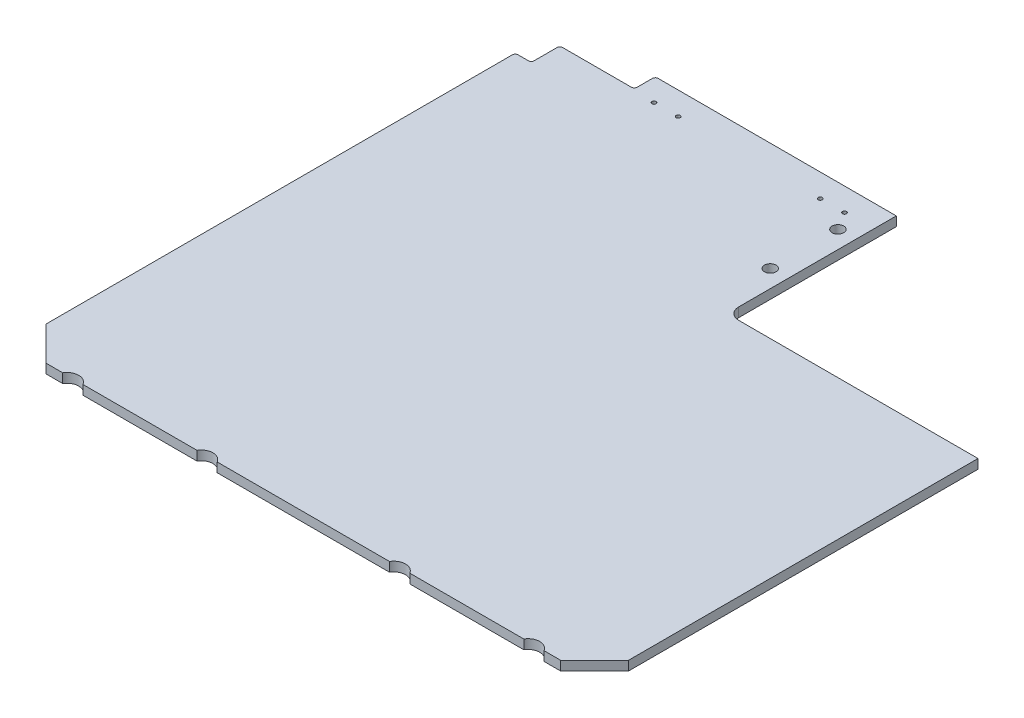
ISO-10303-21;
HEADER;
FILE_DESCRIPTION(('STEP AP214'),'2;1');
FILE_NAME('part.step','',(''),(''),'','','');
FILE_SCHEMA(('AUTOMOTIVE_DESIGN { 1 0 10303 214 1 1 1 1 }'));
ENDSEC;
DATA;
#1=APPLICATION_CONTEXT('core data for automotive mechanical design processes');
#2=APPLICATION_PROTOCOL_DEFINITION('international standard','automotive_design',2000,#1);
#3=PRODUCT_CONTEXT('',#1,'mechanical');
#4=PRODUCT('Part','Part','',(#3));
#5=PRODUCT_RELATED_PRODUCT_CATEGORY('part','',(#4));
#6=PRODUCT_DEFINITION_FORMATION('','',#4);
#7=PRODUCT_DEFINITION_CONTEXT('part definition',#1,'design');
#8=PRODUCT_DEFINITION('design','',#6,#7);
#9=PRODUCT_DEFINITION_SHAPE('','',#8);
#10=(LENGTH_UNIT() NAMED_UNIT(*) SI_UNIT(.MILLI.,.METRE.));
#11=(NAMED_UNIT(*) PLANE_ANGLE_UNIT() SI_UNIT($,.RADIAN.));
#12=(NAMED_UNIT(*) SI_UNIT($,.STERADIAN.) SOLID_ANGLE_UNIT());
#13=UNCERTAINTY_MEASURE_WITH_UNIT(LENGTH_MEASURE(1.E-05),#10,'distance_accuracy_value','');
#14=(GEOMETRIC_REPRESENTATION_CONTEXT(3) GLOBAL_UNCERTAINTY_ASSIGNED_CONTEXT((#13)) GLOBAL_UNIT_ASSIGNED_CONTEXT((#10,
#11,#12)) REPRESENTATION_CONTEXT('',''));
#15=CARTESIAN_POINT('',(0.,0.,0.));
#16=DIRECTION('',(0.,0.,1.));
#17=DIRECTION('',(1.,0.,0.));
#18=AXIS2_PLACEMENT_3D('',#15,#16,#17);
#19=CARTESIAN_POINT('',(-44.4499999999997,0.799999999999967,44.4500000000004));
#20=DIRECTION('',(0.707106781186542,0.,-0.707106781186553));
#21=DIRECTION('',(-0.707106781186553,0.,-0.707106781186542));
#22=AXIS2_PLACEMENT_3D('',#19,#20,#21);
#23=PLANE('',#22);
#24=DIRECTION('',(0.,1.,0.));
#25=VECTOR('',#24,1.);
#26=CARTESIAN_POINT('',(-44.1000000000001,-0.800000000000023,44.8));
#27=LINE('',#26,#25);
#28=CARTESIAN_POINT('',(-44.1000000000001,-0.800000000000023,44.8));
#29=VERTEX_POINT('',#28);
#30=CARTESIAN_POINT('',(-44.1000000000001,0.799999999999967,44.8));
#31=VERTEX_POINT('',#30);
#32=EDGE_CURVE('E493',#29,#31,#27,.T.);
#33=ORIENTED_EDGE('',*,*,#32,.T.);
#34=DIRECTION('',(0.707106781186553,0.,0.707106781186542));
#35=VECTOR('',#34,1.);
#36=CARTESIAN_POINT('',(-44.4499999999997,0.799999999999967,44.4500000000004));
#37=LINE('',#36,#35);
#38=CARTESIAN_POINT('',(-49.9000000000001,0.799999999999967,39.));
#39=VERTEX_POINT('',#38);
#40=EDGE_CURVE('E269',#39,#31,#37,.T.);
#41=ORIENTED_EDGE('',*,*,#40,.F.);
#42=DIRECTION('',(0.,1.,0.));
#43=VECTOR('',#42,1.);
#44=CARTESIAN_POINT('',(-49.9000000000001,-0.800000000000023,39.));
#45=LINE('',#44,#43);
#46=CARTESIAN_POINT('',(-49.9000000000001,-0.800000000000023,39.));
#47=VERTEX_POINT('',#46);
#48=EDGE_CURVE('E263',#47,#39,#45,.T.);
#49=ORIENTED_EDGE('',*,*,#48,.F.);
#50=DIRECTION('',(0.707106781186553,0.,0.707106781186542));
#51=VECTOR('',#50,1.);
#52=CARTESIAN_POINT('',(-44.4499999999997,-0.800000000000023,44.4500000000004));
#53=LINE('',#52,#51);
#54=EDGE_CURVE('E266',#47,#29,#53,.T.);
#55=ORIENTED_EDGE('',*,*,#54,.T.);
#56=EDGE_LOOP('',(#33,#41,#49,#55));
#57=FACE_BOUND('',#56,.T.);
#58=ADVANCED_FACE('F39',(#57),#23,.F.);
#59=CARTESIAN_POINT('',(44.4499999999995,0.800000000000023,44.4499999999995));
#60=DIRECTION('',(-0.707106781186548,0.,-0.707106781186548));
#61=DIRECTION('',(-0.707106781186548,0.,0.707106781186548));
#62=AXIS2_PLACEMENT_3D('',#59,#60,#61);
#63=PLANE('',#62);
#64=DIRECTION('',(0.,1.,0.));
#65=VECTOR('',#64,1.);
#66=CARTESIAN_POINT('',(44.0999999999991,-0.799999999999967,44.8));
#67=LINE('',#66,#65);
#68=CARTESIAN_POINT('',(44.0999999999991,-0.799999999999967,44.8));
#69=VERTEX_POINT('',#68);
#70=CARTESIAN_POINT('',(44.0999999999991,0.800000000000023,44.8));
#71=VERTEX_POINT('',#70);
#72=EDGE_CURVE('E563',#69,#71,#67,.T.);
#73=ORIENTED_EDGE('',*,*,#72,.F.);
#74=DIRECTION('',(0.707106781186548,0.,-0.707106781186548));
#75=VECTOR('',#74,1.);
#76=CARTESIAN_POINT('',(44.4499999999995,-0.799999999999967,44.4499999999995));
#77=LINE('',#76,#75);
#78=CARTESIAN_POINT('',(49.9000000000001,-0.799999999999967,38.999999999999));
#79=VERTEX_POINT('',#78);
#80=EDGE_CURVE('E272',#69,#79,#77,.T.);
#81=ORIENTED_EDGE('',*,*,#80,.T.);
#82=DIRECTION('',(0.,1.,0.));
#83=VECTOR('',#82,1.);
#84=CARTESIAN_POINT('',(49.9000000000001,-0.799999999999967,38.999999999999));
#85=LINE('',#84,#83);
#86=CARTESIAN_POINT('',(49.9000000000001,0.800000000000023,38.999999999999));
#87=VERTEX_POINT('',#86);
#88=EDGE_CURVE('E264',#79,#87,#85,.T.);
#89=ORIENTED_EDGE('',*,*,#88,.T.);
#90=DIRECTION('',(0.707106781186548,0.,-0.707106781186548));
#91=VECTOR('',#90,1.);
#92=CARTESIAN_POINT('',(44.4499999999995,0.800000000000023,44.4499999999995));
#93=LINE('',#92,#91);
#94=EDGE_CURVE('E241',#71,#87,#93,.T.);
#95=ORIENTED_EDGE('',*,*,#94,.F.);
#96=EDGE_LOOP('',(#73,#81,#89,#95));
#97=FACE_BOUND('',#96,.T.);
#98=ADVANCED_FACE('F383',(#97),#63,.F.);
#99=CARTESIAN_POINT('',(0.,0.799999999999995,0.));
#100=DIRECTION('',(0.,1.,0.));
#101=DIRECTION('',(0.,0.,1.));
#102=AXIS2_PLACEMENT_3D('',#99,#100,#101);
#103=PLANE('',#102);
#104=DIRECTION('',(0.,0.,-1.));
#105=VECTOR('',#104,1.);
#106=CARTESIAN_POINT('',(6.90000000000007,0.799999999999995,-22.9));
#107=LINE('',#106,#105);
#108=CARTESIAN_POINT('',(6.90000000000007,0.799999999999995,-22.9));
#109=VERTEX_POINT('',#108);
#110=CARTESIAN_POINT('',(6.90000000000007,0.799999999999995,-49.9));
#111=VERTEX_POINT('',#110);
#112=EDGE_CURVE('E234',#109,#111,#107,.T.);
#113=ORIENTED_EDGE('',*,*,#112,.T.);
#114=DIRECTION('',(-1.,0.,0.));
#115=VECTOR('',#114,1.);
#116=CARTESIAN_POINT('',(0.,0.799999999999995,-49.9));
#117=LINE('',#116,#115);
#118=CARTESIAN_POINT('',(-33.9000000000002,0.799999999999981,-49.9));
#119=VERTEX_POINT('',#118);
#120=EDGE_CURVE('E243',#111,#119,#117,.T.);
#121=ORIENTED_EDGE('',*,*,#120,.T.);
#122=CARTESIAN_POINT('',(-33.9000000000002,0.799999999999981,-49.4));
#123=DIRECTION('',(0.,1.,0.));
#124=DIRECTION('',(0.,0.,1.));
#125=AXIS2_PLACEMENT_3D('',#122,#123,#124);
#126=CIRCLE('',#125,0.5);
#127=CARTESIAN_POINT('',(-34.4000000000002,0.799999999999981,-49.4));
#128=VERTEX_POINT('',#127);
#129=EDGE_CURVE('E307',#119,#128,#126,.T.);
#130=ORIENTED_EDGE('',*,*,#129,.T.);
#131=DIRECTION('',(0.,0.,1.));
#132=VECTOR('',#131,1.);
#133=CARTESIAN_POINT('',(-34.4000000000002,0.799999999999981,0.));
#134=LINE('',#133,#132);
#135=CARTESIAN_POINT('',(-34.4000000000002,0.799999999999981,-46.8));
#136=VERTEX_POINT('',#135);
#137=EDGE_CURVE('E247',#128,#136,#134,.T.);
#138=ORIENTED_EDGE('',*,*,#137,.T.);
#139=CARTESIAN_POINT('',(-34.9000000000002,0.799999999999981,-46.8));
#140=DIRECTION('',(0.,1.,0.));
#141=DIRECTION('',(0.,0.,1.));
#142=AXIS2_PLACEMENT_3D('',#139,#140,#141);
#143=CIRCLE('',#142,0.5);
#144=CARTESIAN_POINT('',(-34.9000000000002,0.799999999999981,-46.3));
#145=VERTEX_POINT('',#144);
#146=EDGE_CURVE('E300',#136,#145,#143,.F.);
#147=ORIENTED_EDGE('',*,*,#146,.T.);
#148=DIRECTION('',(-1.,0.,0.));
#149=VECTOR('',#148,1.);
#150=CARTESIAN_POINT('',(0.,0.799999999999995,-46.3));
#151=LINE('',#150,#149);
#152=CARTESIAN_POINT('',(-46.6500000000002,0.799999999999967,-46.3));
#153=VERTEX_POINT('',#152);
#154=EDGE_CURVE('E331',#145,#153,#151,.T.);
#155=ORIENTED_EDGE('',*,*,#154,.T.);
#156=CARTESIAN_POINT('',(-46.6500000000002,0.799999999999967,-45.8));
#157=DIRECTION('',(0.,1.,0.));
#158=DIRECTION('',(0.,0.,1.));
#159=AXIS2_PLACEMENT_3D('',#156,#157,#158);
#160=CIRCLE('',#159,0.5);
#161=CARTESIAN_POINT('',(-47.1500000000002,0.799999999999967,-45.8));
#162=VERTEX_POINT('',#161);
#163=EDGE_CURVE('E289',#153,#162,#160,.T.);
#164=ORIENTED_EDGE('',*,*,#163,.T.);
#165=DIRECTION('',(0.,0.,1.));
#166=VECTOR('',#165,1.);
#167=CARTESIAN_POINT('',(-47.1500000000002,0.799999999999967,0.));
#168=LINE('',#167,#166);
#169=CARTESIAN_POINT('',(-47.1500000000002,0.799999999999967,-41.9));
#170=VERTEX_POINT('',#169);
#171=EDGE_CURVE('E328',#162,#170,#168,.T.);
#172=ORIENTED_EDGE('',*,*,#171,.T.);
#173=CARTESIAN_POINT('',(-47.6500000000002,0.799999999999967,-41.9));
#174=DIRECTION('',(0.,1.,0.));
#175=DIRECTION('',(0.,0.,1.));
#176=AXIS2_PLACEMENT_3D('',#173,#174,#175);
#177=CIRCLE('',#176,0.5);
#178=CARTESIAN_POINT('',(-47.6500000000002,0.799999999999967,-41.4));
#179=VERTEX_POINT('',#178);
#180=EDGE_CURVE('E296',#170,#179,#177,.F.);
#181=ORIENTED_EDGE('',*,*,#180,.T.);
#182=DIRECTION('',(-1.,0.,0.));
#183=VECTOR('',#182,1.);
#184=CARTESIAN_POINT('',(1.0449742081743E-12,0.799999999999995,-41.3999999999988));
#185=LINE('',#184,#183);
#186=CARTESIAN_POINT('',(-49.4,0.799999999999967,-41.4000000000001));
#187=VERTEX_POINT('',#186);
#188=EDGE_CURVE('E323',#179,#187,#185,.T.);
#189=ORIENTED_EDGE('',*,*,#188,.T.);
#190=CARTESIAN_POINT('',(-49.4000000000001,0.799999999999967,-40.9000000000001));
#191=DIRECTION('',(0.,1.,0.));
#192=DIRECTION('',(0.,0.,1.));
#193=AXIS2_PLACEMENT_3D('',#190,#191,#192);
#194=CIRCLE('',#193,0.5);
#195=CARTESIAN_POINT('',(-49.9000000000001,0.799999999999967,-40.9000000000001));
#196=VERTEX_POINT('',#195);
#197=EDGE_CURVE('E305',#187,#196,#194,.T.);
#198=ORIENTED_EDGE('',*,*,#197,.T.);
#199=DIRECTION('',(0.,0.,1.));
#200=VECTOR('',#199,1.);
#201=CARTESIAN_POINT('',(-49.9000000000001,0.799999999999967,0.));
#202=LINE('',#201,#200);
#203=EDGE_CURVE('E329',#196,#39,#202,.T.);
#204=ORIENTED_EDGE('',*,*,#203,.T.);
#205=ORIENTED_EDGE('',*,*,#40,.T.);
#206=DIRECTION('',(1.,0.,0.));
#207=VECTOR('',#206,1.);
#208=CARTESIAN_POINT('',(0.,0.799999999999995,44.8));
#209=LINE('',#208,#207);
#210=CARTESIAN_POINT('',(-41.2320508075689,0.799999999999967,44.8));
#211=VERTEX_POINT('',#210);
#212=EDGE_CURVE('E496',#31,#211,#209,.T.);
#213=ORIENTED_EDGE('',*,*,#212,.T.);
#214=CARTESIAN_POINT('',(-39.5,0.799999999999981,45.8));
#215=DIRECTION('',(0.,1.,0.));
#216=DIRECTION('',(0.,0.,1.));
#217=AXIS2_PLACEMENT_3D('',#214,#215,#216);
#218=CIRCLE('',#217,2.);
#219=CARTESIAN_POINT('',(-37.7679491924311,0.799999999999981,44.8));
#220=VERTEX_POINT('',#219);
#221=EDGE_CURVE('E499',#220,#211,#218,.T.);
#222=ORIENTED_EDGE('',*,*,#221,.F.);
#223=DIRECTION('',(1.,0.,0.));
#224=VECTOR('',#223,1.);
#225=CARTESIAN_POINT('',(0.,0.799999999999995,44.8));
#226=LINE('',#225,#224);
#227=CARTESIAN_POINT('',(-18.2320508075689,0.799999999999995,44.8));
#228=VERTEX_POINT('',#227);
#229=EDGE_CURVE('E525',#220,#228,#226,.T.);
#230=ORIENTED_EDGE('',*,*,#229,.T.);
#231=CARTESIAN_POINT('',(-16.5,0.799999999999995,45.8));
#232=DIRECTION('',(0.,1.,0.));
#233=DIRECTION('',(0.,0.,1.));
#234=AXIS2_PLACEMENT_3D('',#231,#232,#233);
#235=CIRCLE('',#234,2.);
#236=CARTESIAN_POINT('',(-14.7679491924311,0.799999999999981,44.8));
#237=VERTEX_POINT('',#236);
#238=EDGE_CURVE('E522',#237,#228,#235,.T.);
#239=ORIENTED_EDGE('',*,*,#238,.F.);
#240=DIRECTION('',(1.,0.,0.));
#241=VECTOR('',#240,1.);
#242=CARTESIAN_POINT('',(0.,0.799999999999995,44.8));
#243=LINE('',#242,#241);
#244=CARTESIAN_POINT('',(14.7679491924311,0.800000000000009,44.8));
#245=VERTEX_POINT('',#244);
#246=EDGE_CURVE('E519',#237,#245,#243,.T.);
#247=ORIENTED_EDGE('',*,*,#246,.T.);
#248=CARTESIAN_POINT('',(16.5,0.800000000000009,45.8));
#249=DIRECTION('',(0.,1.,0.));
#250=DIRECTION('',(0.,0.,1.));
#251=AXIS2_PLACEMENT_3D('',#248,#249,#250);
#252=CIRCLE('',#251,2.);
#253=CARTESIAN_POINT('',(18.2320508075689,0.800000000000009,44.8));
#254=VERTEX_POINT('',#253);
#255=EDGE_CURVE('E516',#254,#245,#252,.T.);
#256=ORIENTED_EDGE('',*,*,#255,.F.);
#257=DIRECTION('',(1.,0.,0.));
#258=VECTOR('',#257,1.);
#259=CARTESIAN_POINT('',(0.,0.799999999999995,44.8));
#260=LINE('',#259,#258);
#261=CARTESIAN_POINT('',(37.7679491924311,0.800000000000009,44.8));
#262=VERTEX_POINT('',#261);
#263=EDGE_CURVE('E513',#254,#262,#260,.T.);
#264=ORIENTED_EDGE('',*,*,#263,.T.);
#265=CARTESIAN_POINT('',(39.5,0.800000000000009,45.8));
#266=DIRECTION('',(0.,1.,0.));
#267=DIRECTION('',(0.,0.,1.));
#268=AXIS2_PLACEMENT_3D('',#265,#266,#267);
#269=CIRCLE('',#268,2.);
#270=CARTESIAN_POINT('',(41.2320508075689,0.800000000000009,44.8));
#271=VERTEX_POINT('',#270);
#272=EDGE_CURVE('E503',#271,#262,#269,.T.);
#273=ORIENTED_EDGE('',*,*,#272,.F.);
#274=DIRECTION('',(1.,0.,0.));
#275=VECTOR('',#274,1.);
#276=CARTESIAN_POINT('',(0.,0.799999999999995,44.8));
#277=LINE('',#276,#275);
#278=EDGE_CURVE('E500',#271,#71,#277,.T.);
#279=ORIENTED_EDGE('',*,*,#278,.T.);
#280=ORIENTED_EDGE('',*,*,#94,.T.);
#281=DIRECTION('',(0.,0.,-1.));
#282=VECTOR('',#281,1.);
#283=CARTESIAN_POINT('',(49.9000000000001,0.800000000000023,0.));
#284=LINE('',#283,#282);
#285=CARTESIAN_POINT('',(49.9000000000001,0.800000000000023,-20.9));
#286=VERTEX_POINT('',#285);
#287=EDGE_CURVE('E230',#87,#286,#284,.T.);
#288=ORIENTED_EDGE('',*,*,#287,.T.);
#289=DIRECTION('',(-1.,0.,0.));
#290=VECTOR('',#289,1.);
#291=CARTESIAN_POINT('',(49.9000000000001,0.800000000000023,-20.9));
#292=LINE('',#291,#290);
#293=CARTESIAN_POINT('',(8.90000000000008,0.800000000000009,-20.9));
#294=VERTEX_POINT('',#293);
#295=EDGE_CURVE('E212',#286,#294,#292,.T.);
#296=ORIENTED_EDGE('',*,*,#295,.T.);
#297=CARTESIAN_POINT('',(8.90000000000007,0.800000000000009,-22.9));
#298=DIRECTION('',(0.,-1.,0.));
#299=DIRECTION('',(0.,0.,-1.));
#300=AXIS2_PLACEMENT_3D('',#297,#298,#299);
#301=CIRCLE('',#300,2.);
#302=EDGE_CURVE('E223',#294,#109,#301,.T.);
#303=ORIENTED_EDGE('',*,*,#302,.T.);
#304=EDGE_LOOP('',(#113,#121,#130,#138,#147,#155,#164,#172,#181,#189,#198,#204,#205,#213,#222,
#230,#239,#247,#256,#264,#273,#279,#280,#288,#296,#303));
#305=FACE_BOUND('',#304,.T.);
#306=CARTESIAN_POINT('',(1.97500000000007,0.799999999999995,-45.95));
#307=DIRECTION('',(0.,-1.,0.));
#308=DIRECTION('',(0.,0.,-1.));
#309=AXIS2_PLACEMENT_3D('',#306,#307,#308);
#310=CIRCLE('',#309,0.349999999999992);
#311=CARTESIAN_POINT('',(1.97500000000007,0.799999999999995,-46.3));
#312=VERTEX_POINT('',#311);
#313=EDGE_CURVE('E574',#312,#312,#310,.T.);
#314=ORIENTED_EDGE('',*,*,#313,.T.);
#315=EDGE_LOOP('',(#314));
#316=FACE_BOUND('',#315,.T.);
#317=CARTESIAN_POINT('',(-2.17499999999993,0.799999999999995,-45.95));
#318=DIRECTION('',(0.,-1.,0.));
#319=DIRECTION('',(0.,0.,-1.));
#320=AXIS2_PLACEMENT_3D('',#317,#318,#319);
#321=CIRCLE('',#320,0.349999999999991);
#322=CARTESIAN_POINT('',(-2.17499999999993,0.799999999999995,-46.3));
#323=VERTEX_POINT('',#322);
#324=EDGE_CURVE('E588',#323,#323,#321,.T.);
#325=ORIENTED_EDGE('',*,*,#324,.T.);
#326=EDGE_LOOP('',(#325));
#327=FACE_BOUND('',#326,.T.);
#328=CARTESIAN_POINT('',(-26.5249999999999,0.799999999999981,-45.95));
#329=DIRECTION('',(0.,-1.,0.));
#330=DIRECTION('',(0.,0.,-1.));
#331=AXIS2_PLACEMENT_3D('',#328,#329,#330);
#332=CIRCLE('',#331,0.350000000000008);
#333=CARTESIAN_POINT('',(-26.5249999999999,0.799999999999981,-46.3));
#334=VERTEX_POINT('',#333);
#335=EDGE_CURVE('E594',#334,#334,#332,.T.);
#336=ORIENTED_EDGE('',*,*,#335,.T.);
#337=EDGE_LOOP('',(#336));
#338=FACE_BOUND('',#337,.T.);
#339=CARTESIAN_POINT('',(-30.6749999999999,0.799999999999981,-45.95));
#340=DIRECTION('',(0.,-1.,0.));
#341=DIRECTION('',(0.,0.,-1.));
#342=AXIS2_PLACEMENT_3D('',#339,#340,#341);
#343=CIRCLE('',#342,0.350000000000008);
#344=CARTESIAN_POINT('',(-30.6749999999999,0.799999999999981,-46.3));
#345=VERTEX_POINT('',#344);
#346=EDGE_CURVE('E600',#345,#345,#343,.T.);
#347=ORIENTED_EDGE('',*,*,#346,.T.);
#348=EDGE_LOOP('',(#347));
#349=FACE_BOUND('',#348,.T.);
#350=CARTESIAN_POINT('',(3.90000000000007,0.799999999999995,-42.9));
#351=DIRECTION('',(0.,-1.,0.));
#352=DIRECTION('',(0.,0.,-1.));
#353=AXIS2_PLACEMENT_3D('',#350,#351,#352);
#354=CIRCLE('',#353,0.999999999999995);
#355=CARTESIAN_POINT('',(3.90000000000007,0.799999999999995,-43.9));
#356=VERTEX_POINT('',#355);
#357=EDGE_CURVE('E606',#356,#356,#354,.T.);
#358=ORIENTED_EDGE('',*,*,#357,.T.);
#359=EDGE_LOOP('',(#358));
#360=FACE_BOUND('',#359,.T.);
#361=CARTESIAN_POINT('',(3.90000000000007,0.799999999999995,-31.3));
#362=DIRECTION('',(0.,-1.,0.));
#363=DIRECTION('',(0.,0.,-1.));
#364=AXIS2_PLACEMENT_3D('',#361,#362,#363);
#365=CIRCLE('',#364,0.999999999999994);
#366=CARTESIAN_POINT('',(3.90000000000007,0.799999999999995,-32.3));
#367=VERTEX_POINT('',#366);
#368=EDGE_CURVE('E611',#367,#367,#365,.T.);
#369=ORIENTED_EDGE('',*,*,#368,.T.);
#370=EDGE_LOOP('',(#369));
#371=FACE_BOUND('',#370,.T.);
#372=ADVANCED_FACE('F237',(#305,#316,#327,#338,#349,#360,#371),#103,.T.);
#373=CARTESIAN_POINT('',(0.,-0.799999999999995,0.));
#374=DIRECTION('',(0.,1.,0.));
#375=DIRECTION('',(0.,0.,1.));
#376=AXIS2_PLACEMENT_3D('',#373,#374,#375);
#377=PLANE('',#376);
#378=CARTESIAN_POINT('',(1.97500000000007,-0.799999999999995,-45.95));
#379=DIRECTION('',(0.,-1.,0.));
#380=DIRECTION('',(0.,0.,-1.));
#381=AXIS2_PLACEMENT_3D('',#378,#379,#380);
#382=CIRCLE('',#381,0.349999999999992);
#383=CARTESIAN_POINT('',(1.97500000000007,-0.799999999999995,-46.3));
#384=VERTEX_POINT('',#383);
#385=EDGE_CURVE('E578',#384,#384,#382,.T.);
#386=ORIENTED_EDGE('',*,*,#385,.F.);
#387=EDGE_LOOP('',(#386));
#388=FACE_BOUND('',#387,.T.);
#389=CARTESIAN_POINT('',(-2.17499999999993,-0.799999999999995,-45.95));
#390=DIRECTION('',(0.,-1.,0.));
#391=DIRECTION('',(0.,0.,-1.));
#392=AXIS2_PLACEMENT_3D('',#389,#390,#391);
#393=CIRCLE('',#392,0.349999999999991);
#394=CARTESIAN_POINT('',(-2.17499999999993,-0.799999999999995,-46.3));
#395=VERTEX_POINT('',#394);
#396=EDGE_CURVE('E591',#395,#395,#393,.T.);
#397=ORIENTED_EDGE('',*,*,#396,.F.);
#398=EDGE_LOOP('',(#397));
#399=FACE_BOUND('',#398,.T.);
#400=CARTESIAN_POINT('',(-26.5249999999999,-0.800000000000009,-45.95));
#401=DIRECTION('',(0.,-1.,0.));
#402=DIRECTION('',(0.,0.,-1.));
#403=AXIS2_PLACEMENT_3D('',#400,#401,#402);
#404=CIRCLE('',#403,0.350000000000008);
#405=CARTESIAN_POINT('',(-26.5249999999999,-0.800000000000009,-46.3));
#406=VERTEX_POINT('',#405);
#407=EDGE_CURVE('E597',#406,#406,#404,.T.);
#408=ORIENTED_EDGE('',*,*,#407,.F.);
#409=EDGE_LOOP('',(#408));
#410=FACE_BOUND('',#409,.T.);
#411=CARTESIAN_POINT('',(-30.6749999999999,-0.800000000000009,-45.95));
#412=DIRECTION('',(0.,-1.,0.));
#413=DIRECTION('',(0.,0.,-1.));
#414=AXIS2_PLACEMENT_3D('',#411,#412,#413);
#415=CIRCLE('',#414,0.350000000000008);
#416=CARTESIAN_POINT('',(-30.6749999999999,-0.800000000000009,-46.3));
#417=VERTEX_POINT('',#416);
#418=EDGE_CURVE('E603',#417,#417,#415,.T.);
#419=ORIENTED_EDGE('',*,*,#418,.F.);
#420=EDGE_LOOP('',(#419));
#421=FACE_BOUND('',#420,.T.);
#422=CARTESIAN_POINT('',(3.90000000000007,-0.799999999999995,-42.9));
#423=DIRECTION('',(0.,-1.,0.));
#424=DIRECTION('',(0.,0.,-1.));
#425=AXIS2_PLACEMENT_3D('',#422,#423,#424);
#426=CIRCLE('',#425,0.999999999999995);
#427=CARTESIAN_POINT('',(3.90000000000007,-0.799999999999995,-43.9));
#428=VERTEX_POINT('',#427);
#429=EDGE_CURVE('E609',#428,#428,#426,.T.);
#430=ORIENTED_EDGE('',*,*,#429,.F.);
#431=EDGE_LOOP('',(#430));
#432=FACE_BOUND('',#431,.T.);
#433=CARTESIAN_POINT('',(3.90000000000007,-0.799999999999995,-31.3));
#434=DIRECTION('',(0.,-1.,0.));
#435=DIRECTION('',(0.,0.,-1.));
#436=AXIS2_PLACEMENT_3D('',#433,#434,#435);
#437=CIRCLE('',#436,0.999999999999994);
#438=CARTESIAN_POINT('',(3.90000000000007,-0.799999999999995,-32.3));
#439=VERTEX_POINT('',#438);
#440=EDGE_CURVE('E508',#439,#439,#437,.T.);
#441=ORIENTED_EDGE('',*,*,#440,.F.);
#442=EDGE_LOOP('',(#441));
#443=FACE_BOUND('',#442,.T.);
#444=DIRECTION('',(-1.,0.,0.));
#445=VECTOR('',#444,1.);
#446=CARTESIAN_POINT('',(0.,-0.799999999999995,-49.9));
#447=LINE('',#446,#445);
#448=CARTESIAN_POINT('',(6.90000000000007,-0.799999999999995,-49.9));
#449=VERTEX_POINT('',#448);
#450=CARTESIAN_POINT('',(-33.9000000000002,-0.800000000000009,-49.9));
#451=VERTEX_POINT('',#450);
#452=EDGE_CURVE('E260',#449,#451,#447,.T.);
#453=ORIENTED_EDGE('',*,*,#452,.F.);
#454=DIRECTION('',(0.,0.,-1.));
#455=VECTOR('',#454,1.);
#456=CARTESIAN_POINT('',(6.90000000000007,-0.799999999999995,-22.9));
#457=LINE('',#456,#455);
#458=CARTESIAN_POINT('',(6.90000000000007,-0.799999999999995,-22.9));
#459=VERTEX_POINT('',#458);
#460=EDGE_CURVE('E54',#459,#449,#457,.T.);
#461=ORIENTED_EDGE('',*,*,#460,.F.);
#462=CARTESIAN_POINT('',(8.90000000000006,-0.799999999999981,-22.9));
#463=DIRECTION('',(0.,-1.,0.));
#464=DIRECTION('',(0.,0.,-1.));
#465=AXIS2_PLACEMENT_3D('',#462,#463,#464);
#466=CIRCLE('',#465,2.);
#467=CARTESIAN_POINT('',(8.90000000000008,-0.799999999999981,-20.9));
#468=VERTEX_POINT('',#467);
#469=EDGE_CURVE('E573',#468,#459,#466,.T.);
#470=ORIENTED_EDGE('',*,*,#469,.F.);
#471=DIRECTION('',(-1.,0.,0.));
#472=VECTOR('',#471,1.);
#473=CARTESIAN_POINT('',(49.9000000000001,-0.799999999999967,-20.9));
#474=LINE('',#473,#472);
#475=CARTESIAN_POINT('',(49.9000000000001,-0.799999999999967,-20.9));
#476=VERTEX_POINT('',#475);
#477=EDGE_CURVE('E571',#476,#468,#474,.T.);
#478=ORIENTED_EDGE('',*,*,#477,.F.);
#479=DIRECTION('',(0.,0.,-1.));
#480=VECTOR('',#479,1.);
#481=CARTESIAN_POINT('',(49.9000000000001,-0.799999999999967,0.));
#482=LINE('',#481,#480);
#483=EDGE_CURVE('E233',#79,#476,#482,.T.);
#484=ORIENTED_EDGE('',*,*,#483,.F.);
#485=ORIENTED_EDGE('',*,*,#80,.F.);
#486=DIRECTION('',(1.,0.,0.));
#487=VECTOR('',#486,1.);
#488=CARTESIAN_POINT('',(0.,-0.799999999999995,44.8));
#489=LINE('',#488,#487);
#490=CARTESIAN_POINT('',(41.2320508075689,-0.799999999999981,44.8));
#491=VERTEX_POINT('',#490);
#492=EDGE_CURVE('E529',#491,#69,#489,.T.);
#493=ORIENTED_EDGE('',*,*,#492,.F.);
#494=CARTESIAN_POINT('',(39.5,-0.799999999999981,45.8));
#495=DIRECTION('',(0.,1.,0.));
#496=DIRECTION('',(0.,0.,1.));
#497=AXIS2_PLACEMENT_3D('',#494,#495,#496);
#498=CIRCLE('',#497,2.);
#499=CARTESIAN_POINT('',(37.7679491924311,-0.799999999999981,44.8));
#500=VERTEX_POINT('',#499);
#501=EDGE_CURVE('E531',#491,#500,#498,.T.);
#502=ORIENTED_EDGE('',*,*,#501,.T.);
#503=DIRECTION('',(1.,0.,0.));
#504=VECTOR('',#503,1.);
#505=CARTESIAN_POINT('',(0.,-0.799999999999995,44.8));
#506=LINE('',#505,#504);
#507=CARTESIAN_POINT('',(18.2320508075689,-0.799999999999981,44.8));
#508=VERTEX_POINT('',#507);
#509=EDGE_CURVE('E534',#508,#500,#506,.T.);
#510=ORIENTED_EDGE('',*,*,#509,.F.);
#511=CARTESIAN_POINT('',(16.5,-0.799999999999981,45.8));
#512=DIRECTION('',(0.,1.,0.));
#513=DIRECTION('',(0.,0.,1.));
#514=AXIS2_PLACEMENT_3D('',#511,#512,#513);
#515=CIRCLE('',#514,2.);
#516=CARTESIAN_POINT('',(14.7679491924311,-0.799999999999981,44.8));
#517=VERTEX_POINT('',#516);
#518=EDGE_CURVE('E536',#508,#517,#515,.T.);
#519=ORIENTED_EDGE('',*,*,#518,.T.);
#520=DIRECTION('',(1.,0.,0.));
#521=VECTOR('',#520,1.);
#522=CARTESIAN_POINT('',(0.,-0.799999999999995,44.8));
#523=LINE('',#522,#521);
#524=CARTESIAN_POINT('',(-14.7679491924311,-0.800000000000009,44.8));
#525=VERTEX_POINT('',#524);
#526=EDGE_CURVE('E539',#525,#517,#523,.T.);
#527=ORIENTED_EDGE('',*,*,#526,.F.);
#528=CARTESIAN_POINT('',(-16.5,-0.799999999999995,45.8));
#529=DIRECTION('',(0.,1.,0.));
#530=DIRECTION('',(0.,0.,1.));
#531=AXIS2_PLACEMENT_3D('',#528,#529,#530);
#532=CIRCLE('',#531,2.);
#533=CARTESIAN_POINT('',(-18.2320508075689,-0.799999999999995,44.8));
#534=VERTEX_POINT('',#533);
#535=EDGE_CURVE('E541',#525,#534,#532,.T.);
#536=ORIENTED_EDGE('',*,*,#535,.T.);
#537=DIRECTION('',(1.,0.,0.));
#538=VECTOR('',#537,1.);
#539=CARTESIAN_POINT('',(0.,-0.799999999999995,44.8));
#540=LINE('',#539,#538);
#541=CARTESIAN_POINT('',(-37.7679491924311,-0.800000000000009,44.8));
#542=VERTEX_POINT('',#541);
#543=EDGE_CURVE('E544',#542,#534,#540,.T.);
#544=ORIENTED_EDGE('',*,*,#543,.F.);
#545=CARTESIAN_POINT('',(-39.5,-0.800000000000009,45.8));
#546=DIRECTION('',(0.,1.,0.));
#547=DIRECTION('',(0.,0.,1.));
#548=AXIS2_PLACEMENT_3D('',#545,#546,#547);
#549=CIRCLE('',#548,2.);
#550=CARTESIAN_POINT('',(-41.2320508075689,-0.800000000000023,44.8));
#551=VERTEX_POINT('',#550);
#552=EDGE_CURVE('E546',#542,#551,#549,.T.);
#553=ORIENTED_EDGE('',*,*,#552,.T.);
#554=DIRECTION('',(1.,0.,0.));
#555=VECTOR('',#554,1.);
#556=CARTESIAN_POINT('',(0.,-0.799999999999995,44.8));
#557=LINE('',#556,#555);
#558=EDGE_CURVE('E491',#29,#551,#557,.T.);
#559=ORIENTED_EDGE('',*,*,#558,.F.);
#560=ORIENTED_EDGE('',*,*,#54,.F.);
#561=DIRECTION('',(0.,0.,1.));
#562=VECTOR('',#561,1.);
#563=CARTESIAN_POINT('',(-49.9000000000001,-0.800000000000023,0.));
#564=LINE('',#563,#562);
#565=CARTESIAN_POINT('',(-49.9000000000001,-0.800000000000023,-40.9000000000001));
#566=VERTEX_POINT('',#565);
#567=EDGE_CURVE('E242',#566,#47,#564,.T.);
#568=ORIENTED_EDGE('',*,*,#567,.F.);
#569=CARTESIAN_POINT('',(-49.4000000000001,-0.800000000000023,-40.9000000000001));
#570=DIRECTION('',(0.,1.,0.));
#571=DIRECTION('',(0.,0.,1.));
#572=AXIS2_PLACEMENT_3D('',#569,#570,#571);
#573=CIRCLE('',#572,0.5);
#574=CARTESIAN_POINT('',(-49.4,-0.800000000000023,-41.4000000000001));
#575=VERTEX_POINT('',#574);
#576=EDGE_CURVE('E62',#566,#575,#573,.F.);
#577=ORIENTED_EDGE('',*,*,#576,.T.);
#578=DIRECTION('',(-1.,0.,0.));
#579=VECTOR('',#578,1.);
#580=CARTESIAN_POINT('',(1.04426366543854E-12,-0.799999999999995,-41.3999999999988));
#581=LINE('',#580,#579);
#582=CARTESIAN_POINT('',(-47.6500000000002,-0.800000000000023,-41.4));
#583=VERTEX_POINT('',#582);
#584=EDGE_CURVE('E245',#583,#575,#581,.T.);
#585=ORIENTED_EDGE('',*,*,#584,.F.);
#586=CARTESIAN_POINT('',(-47.6500000000002,-0.800000000000023,-41.9));
#587=DIRECTION('',(0.,1.,0.));
#588=DIRECTION('',(0.,0.,1.));
#589=AXIS2_PLACEMENT_3D('',#586,#587,#588);
#590=CIRCLE('',#589,0.5);
#591=CARTESIAN_POINT('',(-47.1500000000002,-0.800000000000023,-41.9));
#592=VERTEX_POINT('',#591);
#593=EDGE_CURVE('E298',#583,#592,#590,.T.);
#594=ORIENTED_EDGE('',*,*,#593,.T.);
#595=DIRECTION('',(0.,0.,1.));
#596=VECTOR('',#595,1.);
#597=CARTESIAN_POINT('',(-47.1500000000002,-0.800000000000023,0.));
#598=LINE('',#597,#596);
#599=CARTESIAN_POINT('',(-47.1500000000002,-0.800000000000023,-45.8));
#600=VERTEX_POINT('',#599);
#601=EDGE_CURVE('E252',#600,#592,#598,.T.);
#602=ORIENTED_EDGE('',*,*,#601,.F.);
#603=CARTESIAN_POINT('',(-46.6500000000002,-0.800000000000023,-45.8));
#604=DIRECTION('',(0.,1.,0.));
#605=DIRECTION('',(0.,0.,1.));
#606=AXIS2_PLACEMENT_3D('',#603,#604,#605);
#607=CIRCLE('',#606,0.5);
#608=CARTESIAN_POINT('',(-46.6500000000002,-0.800000000000023,-46.3));
#609=VERTEX_POINT('',#608);
#610=EDGE_CURVE('E291',#600,#609,#607,.F.);
#611=ORIENTED_EDGE('',*,*,#610,.T.);
#612=DIRECTION('',(-1.,0.,0.));
#613=VECTOR('',#612,1.);
#614=CARTESIAN_POINT('',(0.,-0.799999999999995,-46.3));
#615=LINE('',#614,#613);
#616=CARTESIAN_POINT('',(-34.9000000000002,-0.800000000000009,-46.3));
#617=VERTEX_POINT('',#616);
#618=EDGE_CURVE('E255',#617,#609,#615,.T.);
#619=ORIENTED_EDGE('',*,*,#618,.F.);
#620=CARTESIAN_POINT('',(-34.9000000000002,-0.800000000000009,-46.8));
#621=DIRECTION('',(0.,1.,0.));
#622=DIRECTION('',(0.,0.,1.));
#623=AXIS2_PLACEMENT_3D('',#620,#621,#622);
#624=CIRCLE('',#623,0.5);
#625=CARTESIAN_POINT('',(-34.4000000000002,-0.800000000000009,-46.8));
#626=VERTEX_POINT('',#625);
#627=EDGE_CURVE('E302',#617,#626,#624,.T.);
#628=ORIENTED_EDGE('',*,*,#627,.T.);
#629=DIRECTION('',(0.,0.,1.));
#630=VECTOR('',#629,1.);
#631=CARTESIAN_POINT('',(-34.4000000000002,-0.800000000000009,0.));
#632=LINE('',#631,#630);
#633=CARTESIAN_POINT('',(-34.4000000000002,-0.800000000000009,-49.4));
#634=VERTEX_POINT('',#633);
#635=EDGE_CURVE('E258',#634,#626,#632,.T.);
#636=ORIENTED_EDGE('',*,*,#635,.F.);
#637=CARTESIAN_POINT('',(-33.9000000000002,-0.800000000000009,-49.4));
#638=DIRECTION('',(0.,1.,0.));
#639=DIRECTION('',(0.,0.,1.));
#640=AXIS2_PLACEMENT_3D('',#637,#638,#639);
#641=CIRCLE('',#640,0.5);
#642=EDGE_CURVE('E310',#634,#451,#641,.F.);
#643=ORIENTED_EDGE('',*,*,#642,.T.);
#644=EDGE_LOOP('',(#453,#461,#470,#478,#484,#485,#493,#502,#510,#519,#527,#536,#544,#553,#559,
#560,#568,#577,#585,#594,#602,#611,#619,#628,#636,#643));
#645=FACE_BOUND('',#644,.T.);
#646=ADVANCED_FACE('F354',(#388,#399,#410,#421,#432,#443,#645),#377,.F.);
#647=CARTESIAN_POINT('',(49.9000000000001,-0.799999999999967,0.));
#648=DIRECTION('',(1.,0.,0.));
#649=DIRECTION('',(0.,0.,-1.));
#650=AXIS2_PLACEMENT_3D('',#647,#648,#649);
#651=PLANE('',#650);
#652=DIRECTION('',(0.,-1.,0.));
#653=VECTOR('',#652,1.);
#654=CARTESIAN_POINT('',(49.9000000000001,0.800000000000023,-20.9));
#655=LINE('',#654,#653);
#656=EDGE_CURVE('E216',#286,#476,#655,.T.);
#657=ORIENTED_EDGE('',*,*,#656,.F.);
#658=ORIENTED_EDGE('',*,*,#287,.F.);
#659=ORIENTED_EDGE('',*,*,#88,.F.);
#660=ORIENTED_EDGE('',*,*,#483,.T.);
#661=EDGE_LOOP('',(#657,#658,#659,#660));
#662=FACE_BOUND('',#661,.T.);
#663=ADVANCED_FACE('F228',(#662),#651,.T.);
#664=CARTESIAN_POINT('',(0.,-0.799999999999995,-49.9));
#665=DIRECTION('',(0.,0.,-1.));
#666=DIRECTION('',(-1.,0.,0.));
#667=AXIS2_PLACEMENT_3D('',#664,#665,#666);
#668=PLANE('',#667);
#669=DIRECTION('',(0.,-1.,0.));
#670=VECTOR('',#669,1.);
#671=CARTESIAN_POINT('',(6.90000000000007,0.799999999999995,-49.9));
#672=LINE('',#671,#670);
#673=EDGE_CURVE('E501',#111,#449,#672,.T.);
#674=ORIENTED_EDGE('',*,*,#673,.T.);
#675=ORIENTED_EDGE('',*,*,#452,.T.);
#676=DIRECTION('',(0.,1.,0.));
#677=VECTOR('',#676,1.);
#678=CARTESIAN_POINT('',(-33.9000000000002,-0.800000000000009,-49.9));
#679=LINE('',#678,#677);
#680=EDGE_CURVE('E313',#451,#119,#679,.T.);
#681=ORIENTED_EDGE('',*,*,#680,.T.);
#682=ORIENTED_EDGE('',*,*,#120,.F.);
#683=EDGE_LOOP('',(#674,#675,#681,#682));
#684=FACE_BOUND('',#683,.T.);
#685=ADVANCED_FACE('F410',(#684),#668,.T.);
#686=CARTESIAN_POINT('',(-34.4000000000002,-0.800000000000009,0.));
#687=DIRECTION('',(-1.,0.,0.));
#688=DIRECTION('',(0.,0.,1.));
#689=AXIS2_PLACEMENT_3D('',#686,#687,#688);
#690=PLANE('',#689);
#691=ORIENTED_EDGE('',*,*,#137,.F.);
#692=DIRECTION('',(0.,1.,0.));
#693=VECTOR('',#692,1.);
#694=CARTESIAN_POINT('',(-34.4000000000002,-0.800000000000009,-49.4));
#695=LINE('',#694,#693);
#696=EDGE_CURVE('E316',#128,#634,#695,.F.);
#697=ORIENTED_EDGE('',*,*,#696,.T.);
#698=ORIENTED_EDGE('',*,*,#635,.T.);
#699=DIRECTION('',(0.,1.,0.));
#700=VECTOR('',#699,1.);
#701=CARTESIAN_POINT('',(-34.4000000000002,0.799999999999981,-46.8));
#702=LINE('',#701,#700);
#703=EDGE_CURVE('E293',#626,#136,#702,.T.);
#704=ORIENTED_EDGE('',*,*,#703,.T.);
#705=EDGE_LOOP('',(#691,#697,#698,#704));
#706=FACE_BOUND('',#705,.T.);
#707=ADVANCED_FACE('F349',(#706),#690,.T.);
#708=CARTESIAN_POINT('',(0.,-0.799999999999995,-46.3));
#709=DIRECTION('',(0.,0.,-1.));
#710=DIRECTION('',(-1.,0.,0.));
#711=AXIS2_PLACEMENT_3D('',#708,#709,#710);
#712=PLANE('',#711);
#713=ORIENTED_EDGE('',*,*,#618,.T.);
#714=DIRECTION('',(0.,1.,0.));
#715=VECTOR('',#714,1.);
#716=CARTESIAN_POINT('',(-46.6500000000002,-0.800000000000023,-46.3));
#717=LINE('',#716,#715);
#718=EDGE_CURVE('E286',#609,#153,#717,.T.);
#719=ORIENTED_EDGE('',*,*,#718,.T.);
#720=ORIENTED_EDGE('',*,*,#154,.F.);
#721=DIRECTION('',(0.,1.,0.));
#722=VECTOR('',#721,1.);
#723=CARTESIAN_POINT('',(-34.9000000000002,-0.800000000000009,-46.3));
#724=LINE('',#723,#722);
#725=EDGE_CURVE('E284',#145,#617,#724,.F.);
#726=ORIENTED_EDGE('',*,*,#725,.T.);
#727=EDGE_LOOP('',(#713,#719,#720,#726));
#728=FACE_BOUND('',#727,.T.);
#729=ADVANCED_FACE('F359',(#728),#712,.T.);
#730=CARTESIAN_POINT('',(-47.1500000000002,-0.800000000000023,0.));
#731=DIRECTION('',(-1.,0.,0.));
#732=DIRECTION('',(0.,0.,1.));
#733=AXIS2_PLACEMENT_3D('',#730,#731,#732);
#734=PLANE('',#733);
#735=ORIENTED_EDGE('',*,*,#601,.T.);
#736=DIRECTION('',(0.,1.,0.));
#737=VECTOR('',#736,1.);
#738=CARTESIAN_POINT('',(-47.1500000000002,0.799999999999967,-41.9));
#739=LINE('',#738,#737);
#740=EDGE_CURVE('E279',#592,#170,#739,.T.);
#741=ORIENTED_EDGE('',*,*,#740,.T.);
#742=ORIENTED_EDGE('',*,*,#171,.F.);
#743=DIRECTION('',(0.,1.,0.));
#744=VECTOR('',#743,1.);
#745=CARTESIAN_POINT('',(-47.1500000000002,-0.800000000000023,-45.8));
#746=LINE('',#745,#744);
#747=EDGE_CURVE('E274',#162,#600,#746,.F.);
#748=ORIENTED_EDGE('',*,*,#747,.T.);
#749=EDGE_LOOP('',(#735,#741,#742,#748));
#750=FACE_BOUND('',#749,.T.);
#751=ADVANCED_FACE('F365',(#750),#734,.T.);
#752=CARTESIAN_POINT('',(1.04426366543854E-12,-0.799999999999995,-41.3999999999988));
#753=DIRECTION('',(0.,0.,-1.));
#754=DIRECTION('',(-1.,0.,0.));
#755=AXIS2_PLACEMENT_3D('',#752,#753,#754);
#756=PLANE('',#755);
#757=ORIENTED_EDGE('',*,*,#584,.T.);
#758=DIRECTION('',(0.,1.,0.));
#759=VECTOR('',#758,1.);
#760=CARTESIAN_POINT('',(-49.4,-0.800000000000023,-41.4000000000001));
#761=LINE('',#760,#759);
#762=EDGE_CURVE('E47',#575,#187,#761,.T.);
#763=ORIENTED_EDGE('',*,*,#762,.T.);
#764=ORIENTED_EDGE('',*,*,#188,.F.);
#765=DIRECTION('',(0.,1.,0.));
#766=VECTOR('',#765,1.);
#767=CARTESIAN_POINT('',(-47.6500000000002,-0.800000000000023,-41.4));
#768=LINE('',#767,#766);
#769=EDGE_CURVE('E282',#179,#583,#768,.F.);
#770=ORIENTED_EDGE('',*,*,#769,.T.);
#771=EDGE_LOOP('',(#757,#763,#764,#770));
#772=FACE_BOUND('',#771,.T.);
#773=ADVANCED_FACE('F322',(#772),#756,.T.);
#774=CARTESIAN_POINT('',(-49.9000000000001,-0.800000000000023,0.));
#775=DIRECTION('',(-1.,0.,0.));
#776=DIRECTION('',(0.,0.,1.));
#777=AXIS2_PLACEMENT_3D('',#774,#775,#776);
#778=PLANE('',#777);
#779=ORIENTED_EDGE('',*,*,#203,.F.);
#780=DIRECTION('',(0.,1.,0.));
#781=VECTOR('',#780,1.);
#782=CARTESIAN_POINT('',(-49.9000000000001,-0.800000000000023,-40.9000000000001));
#783=LINE('',#782,#781);
#784=EDGE_CURVE('E11',#196,#566,#783,.F.);
#785=ORIENTED_EDGE('',*,*,#784,.T.);
#786=ORIENTED_EDGE('',*,*,#567,.T.);
#787=ORIENTED_EDGE('',*,*,#48,.T.);
#788=EDGE_LOOP('',(#779,#785,#786,#787));
#789=FACE_BOUND('',#788,.T.);
#790=ADVANCED_FACE('F397',(#789),#778,.T.);
#791=CARTESIAN_POINT('',(0.,-0.799999999999995,44.8));
#792=DIRECTION('',(0.,0.,1.));
#793=DIRECTION('',(1.,0.,0.));
#794=AXIS2_PLACEMENT_3D('',#791,#792,#793);
#795=PLANE('',#794);
#796=ORIENTED_EDGE('',*,*,#32,.F.);
#797=ORIENTED_EDGE('',*,*,#558,.T.);
#798=DIRECTION('',(0.,1.,0.));
#799=VECTOR('',#798,1.);
#800=CARTESIAN_POINT('',(-41.2320508075689,-0.800000000000023,44.8));
#801=LINE('',#800,#799);
#802=EDGE_CURVE('E333',#551,#211,#801,.T.);
#803=ORIENTED_EDGE('',*,*,#802,.T.);
#804=ORIENTED_EDGE('',*,*,#212,.F.);
#805=EDGE_LOOP('',(#796,#797,#803,#804));
#806=FACE_BOUND('',#805,.T.);
#807=ADVANCED_FACE('F400',(#806),#795,.T.);
#808=CARTESIAN_POINT('',(-39.5,-0.800000000000009,45.8));
#809=DIRECTION('',(0.,1.,0.));
#810=DIRECTION('',(0.,0.,1.));
#811=AXIS2_PLACEMENT_3D('',#808,#809,#810);
#812=CYLINDRICAL_SURFACE('',#811,2.);
#813=ORIENTED_EDGE('',*,*,#802,.F.);
#814=ORIENTED_EDGE('',*,*,#552,.F.);
#815=DIRECTION('',(0.,1.,0.));
#816=VECTOR('',#815,1.);
#817=CARTESIAN_POINT('',(-37.7679491924311,-0.800000000000009,44.8));
#818=LINE('',#817,#816);
#819=EDGE_CURVE('E549',#542,#220,#818,.T.);
#820=ORIENTED_EDGE('',*,*,#819,.T.);
#821=ORIENTED_EDGE('',*,*,#221,.T.);
#822=EDGE_LOOP('',(#813,#814,#820,#821));
#823=FACE_BOUND('',#822,.T.);
#824=ADVANCED_FACE('F417',(#823),#812,.F.);
#825=CARTESIAN_POINT('',(0.,-0.799999999999995,44.8));
#826=DIRECTION('',(0.,0.,1.));
#827=DIRECTION('',(1.,0.,0.));
#828=AXIS2_PLACEMENT_3D('',#825,#826,#827);
#829=PLANE('',#828);
#830=ORIENTED_EDGE('',*,*,#819,.F.);
#831=ORIENTED_EDGE('',*,*,#543,.T.);
#832=DIRECTION('',(0.,1.,0.));
#833=VECTOR('',#832,1.);
#834=CARTESIAN_POINT('',(-18.2320508075689,-0.799999999999995,44.8));
#835=LINE('',#834,#833);
#836=EDGE_CURVE('E551',#534,#228,#835,.T.);
#837=ORIENTED_EDGE('',*,*,#836,.T.);
#838=ORIENTED_EDGE('',*,*,#229,.F.);
#839=EDGE_LOOP('',(#830,#831,#837,#838));
#840=FACE_BOUND('',#839,.T.);
#841=ADVANCED_FACE('F438',(#840),#829,.T.);
#842=CARTESIAN_POINT('',(-16.5,-0.799999999999995,45.8));
#843=DIRECTION('',(0.,1.,0.));
#844=DIRECTION('',(0.,0.,1.));
#845=AXIS2_PLACEMENT_3D('',#842,#843,#844);
#846=CYLINDRICAL_SURFACE('',#845,2.);
#847=ORIENTED_EDGE('',*,*,#836,.F.);
#848=ORIENTED_EDGE('',*,*,#535,.F.);
#849=DIRECTION('',(0.,1.,0.));
#850=VECTOR('',#849,1.);
#851=CARTESIAN_POINT('',(-14.7679491924311,-0.800000000000009,44.8));
#852=LINE('',#851,#850);
#853=EDGE_CURVE('E553',#525,#237,#852,.T.);
#854=ORIENTED_EDGE('',*,*,#853,.T.);
#855=ORIENTED_EDGE('',*,*,#238,.T.);
#856=EDGE_LOOP('',(#847,#848,#854,#855));
#857=FACE_BOUND('',#856,.T.);
#858=ADVANCED_FACE('F434',(#857),#846,.F.);
#859=CARTESIAN_POINT('',(0.,-0.799999999999995,44.8));
#860=DIRECTION('',(0.,0.,1.));
#861=DIRECTION('',(1.,0.,0.));
#862=AXIS2_PLACEMENT_3D('',#859,#860,#861);
#863=PLANE('',#862);
#864=ORIENTED_EDGE('',*,*,#853,.F.);
#865=ORIENTED_EDGE('',*,*,#526,.T.);
#866=DIRECTION('',(0.,1.,0.));
#867=VECTOR('',#866,1.);
#868=CARTESIAN_POINT('',(14.7679491924311,-0.799999999999981,44.8));
#869=LINE('',#868,#867);
#870=EDGE_CURVE('E555',#517,#245,#869,.T.);
#871=ORIENTED_EDGE('',*,*,#870,.T.);
#872=ORIENTED_EDGE('',*,*,#246,.F.);
#873=EDGE_LOOP('',(#864,#865,#871,#872));
#874=FACE_BOUND('',#873,.T.);
#875=ADVANCED_FACE('F430',(#874),#863,.T.);
#876=CARTESIAN_POINT('',(16.5,-0.799999999999981,45.8));
#877=DIRECTION('',(0.,1.,0.));
#878=DIRECTION('',(0.,0.,1.));
#879=AXIS2_PLACEMENT_3D('',#876,#877,#878);
#880=CYLINDRICAL_SURFACE('',#879,2.);
#881=ORIENTED_EDGE('',*,*,#870,.F.);
#882=ORIENTED_EDGE('',*,*,#518,.F.);
#883=DIRECTION('',(0.,1.,0.));
#884=VECTOR('',#883,1.);
#885=CARTESIAN_POINT('',(18.2320508075689,-0.799999999999981,44.8));
#886=LINE('',#885,#884);
#887=EDGE_CURVE('E557',#508,#254,#886,.T.);
#888=ORIENTED_EDGE('',*,*,#887,.T.);
#889=ORIENTED_EDGE('',*,*,#255,.T.);
#890=EDGE_LOOP('',(#881,#882,#888,#889));
#891=FACE_BOUND('',#890,.T.);
#892=ADVANCED_FACE('F426',(#891),#880,.F.);
#893=CARTESIAN_POINT('',(0.,-0.799999999999995,44.8));
#894=DIRECTION('',(0.,0.,1.));
#895=DIRECTION('',(1.,0.,0.));
#896=AXIS2_PLACEMENT_3D('',#893,#894,#895);
#897=PLANE('',#896);
#898=ORIENTED_EDGE('',*,*,#887,.F.);
#899=ORIENTED_EDGE('',*,*,#509,.T.);
#900=DIRECTION('',(0.,1.,0.));
#901=VECTOR('',#900,1.);
#902=CARTESIAN_POINT('',(37.7679491924311,-0.799999999999981,44.8));
#903=LINE('',#902,#901);
#904=EDGE_CURVE('E559',#500,#262,#903,.T.);
#905=ORIENTED_EDGE('',*,*,#904,.T.);
#906=ORIENTED_EDGE('',*,*,#263,.F.);
#907=EDGE_LOOP('',(#898,#899,#905,#906));
#908=FACE_BOUND('',#907,.T.);
#909=ADVANCED_FACE('F422',(#908),#897,.T.);
#910=CARTESIAN_POINT('',(39.5,-0.799999999999981,45.8));
#911=DIRECTION('',(0.,1.,0.));
#912=DIRECTION('',(0.,0.,1.));
#913=AXIS2_PLACEMENT_3D('',#910,#911,#912);
#914=CYLINDRICAL_SURFACE('',#913,2.);
#915=ORIENTED_EDGE('',*,*,#904,.F.);
#916=ORIENTED_EDGE('',*,*,#501,.F.);
#917=DIRECTION('',(0.,1.,0.));
#918=VECTOR('',#917,1.);
#919=CARTESIAN_POINT('',(41.2320508075689,-0.799999999999981,44.8));
#920=LINE('',#919,#918);
#921=EDGE_CURVE('E561',#491,#271,#920,.T.);
#922=ORIENTED_EDGE('',*,*,#921,.T.);
#923=ORIENTED_EDGE('',*,*,#272,.T.);
#924=EDGE_LOOP('',(#915,#916,#922,#923));
#925=FACE_BOUND('',#924,.T.);
#926=ADVANCED_FACE('F378',(#925),#914,.F.);
#927=CARTESIAN_POINT('',(0.,-0.799999999999995,44.8));
#928=DIRECTION('',(0.,0.,1.));
#929=DIRECTION('',(1.,0.,0.));
#930=AXIS2_PLACEMENT_3D('',#927,#928,#929);
#931=PLANE('',#930);
#932=ORIENTED_EDGE('',*,*,#921,.F.);
#933=ORIENTED_EDGE('',*,*,#492,.T.);
#934=ORIENTED_EDGE('',*,*,#72,.T.);
#935=ORIENTED_EDGE('',*,*,#278,.F.);
#936=EDGE_LOOP('',(#932,#933,#934,#935));
#937=FACE_BOUND('',#936,.T.);
#938=ADVANCED_FACE('F371',(#937),#931,.T.);
#939=CARTESIAN_POINT('',(-47.6500000000002,-0.800000000000023,-41.9));
#940=DIRECTION('',(0.,-1.,0.));
#941=DIRECTION('',(0.,0.,-1.));
#942=AXIS2_PLACEMENT_3D('',#939,#940,#941);
#943=CYLINDRICAL_SURFACE('',#942,0.5);
#944=ORIENTED_EDGE('',*,*,#593,.F.);
#945=ORIENTED_EDGE('',*,*,#769,.F.);
#946=ORIENTED_EDGE('',*,*,#180,.F.);
#947=ORIENTED_EDGE('',*,*,#740,.F.);
#948=EDGE_LOOP('',(#944,#945,#946,#947));
#949=FACE_BOUND('',#948,.T.);
#950=ADVANCED_FACE('F369',(#949),#943,.F.);
#951=CARTESIAN_POINT('',(-46.6500000000002,-0.800000000000023,-45.8));
#952=DIRECTION('',(0.,1.,0.));
#953=DIRECTION('',(0.,0.,1.));
#954=AXIS2_PLACEMENT_3D('',#951,#952,#953);
#955=CYLINDRICAL_SURFACE('',#954,0.5);
#956=ORIENTED_EDGE('',*,*,#610,.F.);
#957=ORIENTED_EDGE('',*,*,#747,.F.);
#958=ORIENTED_EDGE('',*,*,#163,.F.);
#959=ORIENTED_EDGE('',*,*,#718,.F.);
#960=EDGE_LOOP('',(#956,#957,#958,#959));
#961=FACE_BOUND('',#960,.T.);
#962=ADVANCED_FACE('F361',(#961),#955,.T.);
#963=CARTESIAN_POINT('',(-34.9000000000002,-0.800000000000009,-46.8));
#964=DIRECTION('',(0.,-1.,0.));
#965=DIRECTION('',(0.,0.,-1.));
#966=AXIS2_PLACEMENT_3D('',#963,#964,#965);
#967=CYLINDRICAL_SURFACE('',#966,0.5);
#968=ORIENTED_EDGE('',*,*,#627,.F.);
#969=ORIENTED_EDGE('',*,*,#725,.F.);
#970=ORIENTED_EDGE('',*,*,#146,.F.);
#971=ORIENTED_EDGE('',*,*,#703,.F.);
#972=EDGE_LOOP('',(#968,#969,#970,#971));
#973=FACE_BOUND('',#972,.T.);
#974=ADVANCED_FACE('F348',(#973),#967,.F.);
#975=CARTESIAN_POINT('',(-33.9000000000002,-0.800000000000009,-49.4));
#976=DIRECTION('',(0.,1.,0.));
#977=DIRECTION('',(0.,0.,1.));
#978=AXIS2_PLACEMENT_3D('',#975,#976,#977);
#979=CYLINDRICAL_SURFACE('',#978,0.5);
#980=ORIENTED_EDGE('',*,*,#642,.F.);
#981=ORIENTED_EDGE('',*,*,#696,.F.);
#982=ORIENTED_EDGE('',*,*,#129,.F.);
#983=ORIENTED_EDGE('',*,*,#680,.F.);
#984=EDGE_LOOP('',(#980,#981,#982,#983));
#985=FACE_BOUND('',#984,.T.);
#986=ADVANCED_FACE('F481',(#985),#979,.T.);
#987=CARTESIAN_POINT('',(-49.4000000000001,-0.800000000000023,-40.9000000000001));
#988=DIRECTION('',(0.,1.,0.));
#989=DIRECTION('',(0.,0.,1.));
#990=AXIS2_PLACEMENT_3D('',#987,#988,#989);
#991=CYLINDRICAL_SURFACE('',#990,0.5);
#992=ORIENTED_EDGE('',*,*,#576,.F.);
#993=ORIENTED_EDGE('',*,*,#784,.F.);
#994=ORIENTED_EDGE('',*,*,#197,.F.);
#995=ORIENTED_EDGE('',*,*,#762,.F.);
#996=EDGE_LOOP('',(#992,#993,#994,#995));
#997=FACE_BOUND('',#996,.T.);
#998=ADVANCED_FACE('F41',(#997),#991,.T.);
#999=CARTESIAN_POINT('',(6.90000000000007,0.799999999999995,-22.9));
#1000=DIRECTION('',(-1.,0.,0.));
#1001=DIRECTION('',(0.,0.,1.));
#1002=AXIS2_PLACEMENT_3D('',#999,#1000,#1001);
#1003=PLANE('',#1002);
#1004=ORIENTED_EDGE('',*,*,#460,.T.);
#1005=ORIENTED_EDGE('',*,*,#673,.F.);
#1006=ORIENTED_EDGE('',*,*,#112,.F.);
#1007=DIRECTION('',(0.,-1.,0.));
#1008=VECTOR('',#1007,1.);
#1009=CARTESIAN_POINT('',(6.90000000000007,0.799999999999995,-22.9));
#1010=LINE('',#1009,#1008);
#1011=EDGE_CURVE('E505',#109,#459,#1010,.T.);
#1012=ORIENTED_EDGE('',*,*,#1011,.T.);
#1013=EDGE_LOOP('',(#1004,#1005,#1006,#1012));
#1014=FACE_BOUND('',#1013,.T.);
#1015=ADVANCED_FACE('F475',(#1014),#1003,.F.);
#1016=CARTESIAN_POINT('',(8.90000000000007,0.800000000000009,-22.9));
#1017=DIRECTION('',(0.,-1.,0.));
#1018=DIRECTION('',(0.,0.,-1.));
#1019=AXIS2_PLACEMENT_3D('',#1016,#1017,#1018);
#1020=CYLINDRICAL_SURFACE('',#1019,2.);
#1021=ORIENTED_EDGE('',*,*,#469,.T.);
#1022=ORIENTED_EDGE('',*,*,#1011,.F.);
#1023=ORIENTED_EDGE('',*,*,#302,.F.);
#1024=DIRECTION('',(0.,-1.,0.));
#1025=VECTOR('',#1024,1.);
#1026=CARTESIAN_POINT('',(8.90000000000008,0.800000000000009,-20.9));
#1027=LINE('',#1026,#1025);
#1028=EDGE_CURVE('E218',#294,#468,#1027,.T.);
#1029=ORIENTED_EDGE('',*,*,#1028,.T.);
#1030=EDGE_LOOP('',(#1021,#1022,#1023,#1029));
#1031=FACE_BOUND('',#1030,.T.);
#1032=ADVANCED_FACE('F472',(#1031),#1020,.F.);
#1033=CARTESIAN_POINT('',(49.9000000000001,0.800000000000023,-20.9));
#1034=DIRECTION('',(0.,0.,1.));
#1035=DIRECTION('',(1.,0.,0.));
#1036=AXIS2_PLACEMENT_3D('',#1033,#1034,#1035);
#1037=PLANE('',#1036);
#1038=ORIENTED_EDGE('',*,*,#477,.T.);
#1039=ORIENTED_EDGE('',*,*,#1028,.F.);
#1040=ORIENTED_EDGE('',*,*,#295,.F.);
#1041=ORIENTED_EDGE('',*,*,#656,.T.);
#1042=EDGE_LOOP('',(#1038,#1039,#1040,#1041));
#1043=FACE_BOUND('',#1042,.T.);
#1044=ADVANCED_FACE('F215',(#1043),#1037,.F.);
#1045=CARTESIAN_POINT('',(3.90000000000007,0.799999999999995,-31.3));
#1046=DIRECTION('',(0.,-1.,0.));
#1047=DIRECTION('',(0.,0.,-1.));
#1048=AXIS2_PLACEMENT_3D('',#1045,#1046,#1047);
#1049=CYLINDRICAL_SURFACE('',#1048,0.999999999999994);
#1050=ORIENTED_EDGE('',*,*,#368,.F.);
#1051=EDGE_LOOP('',(#1050));
#1052=FACE_BOUND('',#1051,.T.);
#1053=ORIENTED_EDGE('',*,*,#440,.T.);
#1054=EDGE_LOOP('',(#1053));
#1055=FACE_BOUND('',#1054,.T.);
#1056=ADVANCED_FACE('F446',(#1052,#1055),#1049,.F.);
#1057=CARTESIAN_POINT('',(3.90000000000007,0.799999999999995,-42.9));
#1058=DIRECTION('',(0.,-1.,0.));
#1059=DIRECTION('',(0.,0.,-1.));
#1060=AXIS2_PLACEMENT_3D('',#1057,#1058,#1059);
#1061=CYLINDRICAL_SURFACE('',#1060,0.999999999999995);
#1062=ORIENTED_EDGE('',*,*,#357,.F.);
#1063=EDGE_LOOP('',(#1062));
#1064=FACE_BOUND('',#1063,.T.);
#1065=ORIENTED_EDGE('',*,*,#429,.T.);
#1066=EDGE_LOOP('',(#1065));
#1067=FACE_BOUND('',#1066,.T.);
#1068=ADVANCED_FACE('F449',(#1064,#1067),#1061,.F.);
#1069=CARTESIAN_POINT('',(-30.6749999999999,0.799999999999981,-45.95));
#1070=DIRECTION('',(0.,-1.,0.));
#1071=DIRECTION('',(0.,0.,-1.));
#1072=AXIS2_PLACEMENT_3D('',#1069,#1070,#1071);
#1073=CYLINDRICAL_SURFACE('',#1072,0.350000000000008);
#1074=ORIENTED_EDGE('',*,*,#346,.F.);
#1075=EDGE_LOOP('',(#1074));
#1076=FACE_BOUND('',#1075,.T.);
#1077=ORIENTED_EDGE('',*,*,#418,.T.);
#1078=EDGE_LOOP('',(#1077));
#1079=FACE_BOUND('',#1078,.T.);
#1080=ADVANCED_FACE('F453',(#1076,#1079),#1073,.F.);
#1081=CARTESIAN_POINT('',(-26.5249999999999,0.799999999999981,-45.95));
#1082=DIRECTION('',(0.,-1.,0.));
#1083=DIRECTION('',(0.,0.,-1.));
#1084=AXIS2_PLACEMENT_3D('',#1081,#1082,#1083);
#1085=CYLINDRICAL_SURFACE('',#1084,0.350000000000008);
#1086=ORIENTED_EDGE('',*,*,#335,.F.);
#1087=EDGE_LOOP('',(#1086));
#1088=FACE_BOUND('',#1087,.T.);
#1089=ORIENTED_EDGE('',*,*,#407,.T.);
#1090=EDGE_LOOP('',(#1089));
#1091=FACE_BOUND('',#1090,.T.);
#1092=ADVANCED_FACE('F457',(#1088,#1091),#1085,.F.);
#1093=CARTESIAN_POINT('',(-2.17499999999993,0.799999999999995,-45.95));
#1094=DIRECTION('',(0.,-1.,0.));
#1095=DIRECTION('',(0.,0.,-1.));
#1096=AXIS2_PLACEMENT_3D('',#1093,#1094,#1095);
#1097=CYLINDRICAL_SURFACE('',#1096,0.349999999999991);
#1098=ORIENTED_EDGE('',*,*,#324,.F.);
#1099=EDGE_LOOP('',(#1098));
#1100=FACE_BOUND('',#1099,.T.);
#1101=ORIENTED_EDGE('',*,*,#396,.T.);
#1102=EDGE_LOOP('',(#1101));
#1103=FACE_BOUND('',#1102,.T.);
#1104=ADVANCED_FACE('F461',(#1100,#1103),#1097,.F.);
#1105=CARTESIAN_POINT('',(1.97500000000007,0.799999999999995,-45.95));
#1106=DIRECTION('',(0.,-1.,0.));
#1107=DIRECTION('',(0.,0.,-1.));
#1108=AXIS2_PLACEMENT_3D('',#1105,#1106,#1107);
#1109=CYLINDRICAL_SURFACE('',#1108,0.349999999999992);
#1110=ORIENTED_EDGE('',*,*,#313,.F.);
#1111=EDGE_LOOP('',(#1110));
#1112=FACE_BOUND('',#1111,.T.);
#1113=ORIENTED_EDGE('',*,*,#385,.T.);
#1114=EDGE_LOOP('',(#1113));
#1115=FACE_BOUND('',#1114,.T.);
#1116=ADVANCED_FACE('F465',(#1112,#1115),#1109,.F.);
#1117=CLOSED_SHELL('',(#58,#98,#372,#646,#663,#685,#707,#729,#751,#773,#790,#807,#824,#841,#858,
#875,#892,#909,#926,#938,#950,#962,#974,#986,#998,#1015,#1032,#1044,#1056,#1068,#1080,#1092,
#1104,#1116));
#1118=MANIFOLD_SOLID_BREP('B2',#1117);
#1119=ADVANCED_BREP_SHAPE_REPRESENTATION('',(#18,#1118),#14);
#1120=SHAPE_DEFINITION_REPRESENTATION(#9,#1119);
ENDSEC;
END-ISO-10303-21;
